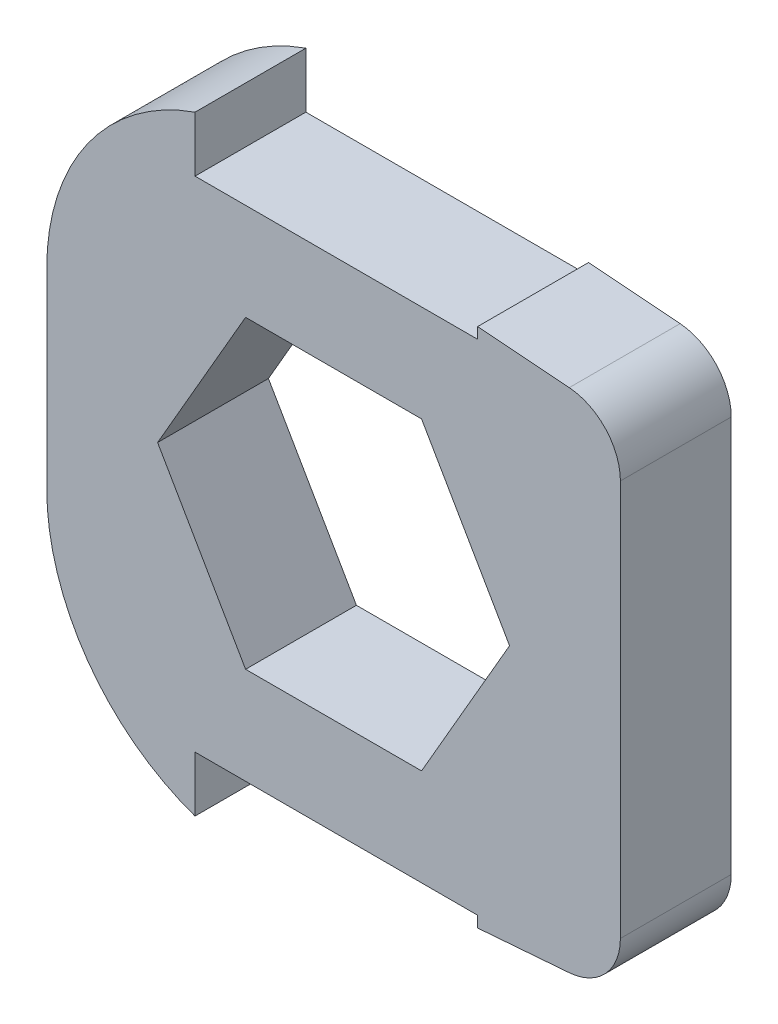
ISO-10303-21;
HEADER;
FILE_DESCRIPTION(('STEP AP214'),'2;1');
FILE_NAME('part.step','',(''),(''),'','','');
FILE_SCHEMA(('AUTOMOTIVE_DESIGN { 1 0 10303 214 1 1 1 1 }'));
ENDSEC;
DATA;
#1=APPLICATION_CONTEXT('core data for automotive mechanical design processes');
#2=APPLICATION_PROTOCOL_DEFINITION('international standard','automotive_design',2000,#1);
#3=PRODUCT_CONTEXT('',#1,'mechanical');
#4=PRODUCT('Part','Part','',(#3));
#5=PRODUCT_RELATED_PRODUCT_CATEGORY('part','',(#4));
#6=PRODUCT_DEFINITION_FORMATION('','',#4);
#7=PRODUCT_DEFINITION_CONTEXT('part definition',#1,'design');
#8=PRODUCT_DEFINITION('design','',#6,#7);
#9=PRODUCT_DEFINITION_SHAPE('','',#8);
#10=(LENGTH_UNIT() NAMED_UNIT(*) SI_UNIT(.MILLI.,.METRE.));
#11=(NAMED_UNIT(*) PLANE_ANGLE_UNIT() SI_UNIT($,.RADIAN.));
#12=(NAMED_UNIT(*) SI_UNIT($,.STERADIAN.) SOLID_ANGLE_UNIT());
#13=UNCERTAINTY_MEASURE_WITH_UNIT(LENGTH_MEASURE(1.E-05),#10,'distance_accuracy_value','');
#14=(GEOMETRIC_REPRESENTATION_CONTEXT(3) GLOBAL_UNCERTAINTY_ASSIGNED_CONTEXT((#13)) GLOBAL_UNIT_ASSIGNED_CONTEXT((#10,
#11,#12)) REPRESENTATION_CONTEXT('',''));
#15=CARTESIAN_POINT('',(0.,0.,0.));
#16=DIRECTION('',(0.,0.,1.));
#17=DIRECTION('',(1.,0.,0.));
#18=AXIS2_PLACEMENT_3D('',#15,#16,#17);
#19=CARTESIAN_POINT('',(0.,0.,2.));
#20=DIRECTION('',(0.,0.,-1.));
#21=DIRECTION('',(-1.,0.,0.));
#22=AXIS2_PLACEMENT_3D('',#19,#20,#21);
#23=PLANE('',#22);
#24=DIRECTION('',(0.996998261930065,0.0774239349841488,0.));
#25=VECTOR('',#24,1.);
#26=CARTESIAN_POINT('',(10.3508529610859,-4.5,2.));
#27=LINE('',#26,#25);
#28=CARTESIAN_POINT('',(7.77542648054295,-4.7,2.));
#29=VERTEX_POINT('',#28);
#30=CARTESIAN_POINT('',(9.42827689607004,-4.57164452738106,2.));
#31=VERTEX_POINT('',#30);
#32=EDGE_CURVE('E243',#29,#31,#27,.T.);
#33=ORIENTED_EDGE('',*,*,#32,.T.);
#34=CARTESIAN_POINT('',(9.35085296108589,-3.57464626545099,2.));
#35=DIRECTION('',(0.,0.,-1.));
#36=DIRECTION('',(-1.,0.,0.));
#37=AXIS2_PLACEMENT_3D('',#34,#35,#36);
#38=CIRCLE('',#37,1.);
#39=CARTESIAN_POINT('',(10.3508529610859,-3.57464626545099,2.));
#40=VERTEX_POINT('',#39);
#41=EDGE_CURVE('E44',#31,#40,#38,.F.);
#42=ORIENTED_EDGE('',*,*,#41,.T.);
#43=DIRECTION('',(0.,1.,0.));
#44=VECTOR('',#43,1.);
#45=CARTESIAN_POINT('',(10.3508529610859,4.5,2.));
#46=LINE('',#45,#44);
#47=CARTESIAN_POINT('',(10.3508529610859,3.574646265451,2.));
#48=VERTEX_POINT('',#47);
#49=EDGE_CURVE('E245',#40,#48,#46,.T.);
#50=ORIENTED_EDGE('',*,*,#49,.T.);
#51=CARTESIAN_POINT('',(9.35085296108589,3.574646265451,2.));
#52=DIRECTION('',(0.,0.,-1.));
#53=DIRECTION('',(-1.,0.,0.));
#54=AXIS2_PLACEMENT_3D('',#51,#52,#53);
#55=CIRCLE('',#54,1.);
#56=CARTESIAN_POINT('',(9.42827689607004,4.57164452738106,2.));
#57=VERTEX_POINT('',#56);
#58=EDGE_CURVE('E51',#48,#57,#55,.F.);
#59=ORIENTED_EDGE('',*,*,#58,.T.);
#60=DIRECTION('',(-0.996998261930065,0.0774239349841488,0.));
#61=VECTOR('',#60,1.);
#62=CARTESIAN_POINT('',(10.3508529610859,4.5,2.));
#63=LINE('',#62,#61);
#64=CARTESIAN_POINT('',(7.77542648054295,4.7,2.));
#65=VERTEX_POINT('',#64);
#66=EDGE_CURVE('E247',#57,#65,#63,.T.);
#67=ORIENTED_EDGE('',*,*,#66,.T.);
#68=DIRECTION('',(0.,-1.,0.));
#69=VECTOR('',#68,1.);
#70=CARTESIAN_POINT('',(7.77542648054295,4.7,2.));
#71=LINE('',#70,#69);
#72=CARTESIAN_POINT('',(7.77542648054295,4.5,2.));
#73=VERTEX_POINT('',#72);
#74=EDGE_CURVE('E249',#65,#73,#71,.T.);
#75=ORIENTED_EDGE('',*,*,#74,.T.);
#76=DIRECTION('',(-1.,0.,0.));
#77=VECTOR('',#76,1.);
#78=CARTESIAN_POINT('',(7.77542648054295,4.5,2.));
#79=LINE('',#78,#77);
#80=CARTESIAN_POINT('',(2.67542648054295,4.5,2.));
#81=VERTEX_POINT('',#80);
#82=EDGE_CURVE('E251',#73,#81,#79,.T.);
#83=ORIENTED_EDGE('',*,*,#82,.T.);
#84=DIRECTION('',(0.,1.,0.));
#85=VECTOR('',#84,1.);
#86=CARTESIAN_POINT('',(2.67542648054295,5.5,2.));
#87=LINE('',#86,#85);
#88=CARTESIAN_POINT('',(2.67542648054295,5.5,2.));
#89=VERTEX_POINT('',#88);
#90=EDGE_CURVE('E253',#81,#89,#87,.T.);
#91=ORIENTED_EDGE('',*,*,#90,.T.);
#92=CARTESIAN_POINT('',(4.,1.72567820773676,2.));
#93=DIRECTION('',(0.,0.,-1.));
#94=DIRECTION('',(-1.,0.,0.));
#95=AXIS2_PLACEMENT_3D('',#92,#93,#94);
#96=CIRCLE('',#95,4.);
#97=CARTESIAN_POINT('',(0.,1.72567820773676,2.));
#98=VERTEX_POINT('',#97);
#99=EDGE_CURVE('E309',#89,#98,#96,.F.);
#100=ORIENTED_EDGE('',*,*,#99,.T.);
#101=DIRECTION('',(0.,-1.,0.));
#102=VECTOR('',#101,1.);
#103=CARTESIAN_POINT('',(0.,-5.5,2.));
#104=LINE('',#103,#102);
#105=CARTESIAN_POINT('',(0.,-1.72567820773676,2.));
#106=VERTEX_POINT('',#105);
#107=EDGE_CURVE('E233',#98,#106,#104,.T.);
#108=ORIENTED_EDGE('',*,*,#107,.T.);
#109=CARTESIAN_POINT('',(4.,-1.72567820773676,2.));
#110=DIRECTION('',(0.,0.,-1.));
#111=DIRECTION('',(-1.,0.,0.));
#112=AXIS2_PLACEMENT_3D('',#109,#110,#111);
#113=CIRCLE('',#112,4.);
#114=CARTESIAN_POINT('',(2.67542648054295,-5.5,2.));
#115=VERTEX_POINT('',#114);
#116=EDGE_CURVE('E311',#106,#115,#113,.F.);
#117=ORIENTED_EDGE('',*,*,#116,.T.);
#118=DIRECTION('',(0.,1.,0.));
#119=VECTOR('',#118,1.);
#120=CARTESIAN_POINT('',(2.67542648054295,-4.5,2.));
#121=LINE('',#120,#119);
#122=CARTESIAN_POINT('',(2.67542648054295,-4.5,2.));
#123=VERTEX_POINT('',#122);
#124=EDGE_CURVE('E236',#115,#123,#121,.T.);
#125=ORIENTED_EDGE('',*,*,#124,.T.);
#126=DIRECTION('',(1.,0.,0.));
#127=VECTOR('',#126,1.);
#128=CARTESIAN_POINT('',(7.77542648054295,-4.5,2.));
#129=LINE('',#128,#127);
#130=CARTESIAN_POINT('',(7.77542648054295,-4.5,2.));
#131=VERTEX_POINT('',#130);
#132=EDGE_CURVE('E239',#123,#131,#129,.T.);
#133=ORIENTED_EDGE('',*,*,#132,.T.);
#134=DIRECTION('',(0.,-1.,0.));
#135=VECTOR('',#134,1.);
#136=CARTESIAN_POINT('',(7.77542648054295,-4.7,2.));
#137=LINE('',#136,#135);
#138=EDGE_CURVE('E241',#131,#29,#137,.T.);
#139=ORIENTED_EDGE('',*,*,#138,.T.);
#140=EDGE_LOOP('',(#33,#42,#50,#59,#67,#75,#83,#91,#100,#108,#117,#125,#133,#139));
#141=FACE_BOUND('',#140,.T.);
#142=DIRECTION('',(-0.5,-0.866025403784438,0.));
#143=VECTOR('',#142,1.);
#144=CARTESIAN_POINT('',(3.58771324027147,2.75,2.));
#145=LINE('',#144,#143);
#146=CARTESIAN_POINT('',(3.58771324027147,2.75,2.));
#147=VERTEX_POINT('',#146);
#148=CARTESIAN_POINT('',(2.,0.,2.));
#149=VERTEX_POINT('',#148);
#150=EDGE_CURVE('E177',#147,#149,#145,.T.);
#151=ORIENTED_EDGE('',*,*,#150,.F.);
#152=DIRECTION('',(-1.,0.,0.));
#153=VECTOR('',#152,1.);
#154=CARTESIAN_POINT('',(6.76313972081442,2.75,2.));
#155=LINE('',#154,#153);
#156=CARTESIAN_POINT('',(6.76313972081442,2.75,2.));
#157=VERTEX_POINT('',#156);
#158=EDGE_CURVE('E209',#157,#147,#155,.T.);
#159=ORIENTED_EDGE('',*,*,#158,.F.);
#160=DIRECTION('',(-0.5,0.866025403784438,0.));
#161=VECTOR('',#160,1.);
#162=CARTESIAN_POINT('',(8.35085296108589,0.,2.));
#163=LINE('',#162,#161);
#164=CARTESIAN_POINT('',(8.35085296108589,0.,2.));
#165=VERTEX_POINT('',#164);
#166=EDGE_CURVE('E206',#165,#157,#163,.T.);
#167=ORIENTED_EDGE('',*,*,#166,.F.);
#168=DIRECTION('',(0.5,0.866025403784439,0.));
#169=VECTOR('',#168,1.);
#170=CARTESIAN_POINT('',(6.76313972081442,-2.75,2.));
#171=LINE('',#170,#169);
#172=CARTESIAN_POINT('',(6.76313972081442,-2.75,2.));
#173=VERTEX_POINT('',#172);
#174=EDGE_CURVE('E202',#173,#165,#171,.T.);
#175=ORIENTED_EDGE('',*,*,#174,.F.);
#176=DIRECTION('',(1.,0.,0.));
#177=VECTOR('',#176,1.);
#178=CARTESIAN_POINT('',(3.58771324027147,-2.75,2.));
#179=LINE('',#178,#177);
#180=CARTESIAN_POINT('',(3.58771324027147,-2.75,2.));
#181=VERTEX_POINT('',#180);
#182=EDGE_CURVE('E200',#181,#173,#179,.T.);
#183=ORIENTED_EDGE('',*,*,#182,.F.);
#184=DIRECTION('',(0.500000000000002,-0.866025403784438,0.));
#185=VECTOR('',#184,1.);
#186=CARTESIAN_POINT('',(2.,0.,2.));
#187=LINE('',#186,#185);
#188=EDGE_CURVE('E187',#149,#181,#187,.T.);
#189=ORIENTED_EDGE('',*,*,#188,.F.);
#190=EDGE_LOOP('',(#151,#159,#167,#175,#183,#189));
#191=FACE_BOUND('',#190,.T.);
#192=ADVANCED_FACE('F36',(#141,#191),#23,.F.);
#193=CARTESIAN_POINT('',(0.,0.,0.));
#194=DIRECTION('',(0.,0.,-1.));
#195=DIRECTION('',(-1.,0.,0.));
#196=AXIS2_PLACEMENT_3D('',#193,#194,#195);
#197=PLANE('',#196);
#198=DIRECTION('',(0.,1.,0.));
#199=VECTOR('',#198,1.);
#200=CARTESIAN_POINT('',(10.3508529610859,4.5,0.));
#201=LINE('',#200,#199);
#202=CARTESIAN_POINT('',(10.3508529610859,-3.57464626545099,0.));
#203=VERTEX_POINT('',#202);
#204=CARTESIAN_POINT('',(10.3508529610859,3.574646265451,0.));
#205=VERTEX_POINT('',#204);
#206=EDGE_CURVE('E266',#203,#205,#201,.T.);
#207=ORIENTED_EDGE('',*,*,#206,.F.);
#208=CARTESIAN_POINT('',(9.35085296108589,-3.57464626545099,0.));
#209=DIRECTION('',(0.,0.,-1.));
#210=DIRECTION('',(-1.,0.,0.));
#211=AXIS2_PLACEMENT_3D('',#208,#209,#210);
#212=CIRCLE('',#211,1.);
#213=CARTESIAN_POINT('',(9.42827689607004,-4.57164452738106,0.));
#214=VERTEX_POINT('',#213);
#215=EDGE_CURVE('E320',#203,#214,#212,.T.);
#216=ORIENTED_EDGE('',*,*,#215,.T.);
#217=DIRECTION('',(0.996998261930065,0.0774239349841488,0.));
#218=VECTOR('',#217,1.);
#219=CARTESIAN_POINT('',(10.3508529610859,-4.5,0.));
#220=LINE('',#219,#218);
#221=CARTESIAN_POINT('',(7.77542648054295,-4.7,0.));
#222=VERTEX_POINT('',#221);
#223=EDGE_CURVE('E264',#222,#214,#220,.T.);
#224=ORIENTED_EDGE('',*,*,#223,.F.);
#225=DIRECTION('',(0.,-1.,0.));
#226=VECTOR('',#225,1.);
#227=CARTESIAN_POINT('',(7.77542648054295,-4.7,0.));
#228=LINE('',#227,#226);
#229=CARTESIAN_POINT('',(7.77542648054295,-4.5,0.));
#230=VERTEX_POINT('',#229);
#231=EDGE_CURVE('E262',#230,#222,#228,.T.);
#232=ORIENTED_EDGE('',*,*,#231,.F.);
#233=DIRECTION('',(1.,0.,0.));
#234=VECTOR('',#233,1.);
#235=CARTESIAN_POINT('',(7.77542648054295,-4.5,0.));
#236=LINE('',#235,#234);
#237=CARTESIAN_POINT('',(2.67542648054295,-4.5,0.));
#238=VERTEX_POINT('',#237);
#239=EDGE_CURVE('E260',#238,#230,#236,.T.);
#240=ORIENTED_EDGE('',*,*,#239,.F.);
#241=DIRECTION('',(0.,1.,0.));
#242=VECTOR('',#241,1.);
#243=CARTESIAN_POINT('',(2.67542648054295,-4.5,0.));
#244=LINE('',#243,#242);
#245=CARTESIAN_POINT('',(2.67542648054295,-5.5,0.));
#246=VERTEX_POINT('',#245);
#247=EDGE_CURVE('E258',#246,#238,#244,.T.);
#248=ORIENTED_EDGE('',*,*,#247,.F.);
#249=CARTESIAN_POINT('',(4.,-1.72567820773676,0.));
#250=DIRECTION('',(0.,0.,-1.));
#251=DIRECTION('',(-1.,0.,0.));
#252=AXIS2_PLACEMENT_3D('',#249,#250,#251);
#253=CIRCLE('',#252,4.);
#254=CARTESIAN_POINT('',(0.,-1.72567820773676,0.));
#255=VERTEX_POINT('',#254);
#256=EDGE_CURVE('E302',#246,#255,#253,.T.);
#257=ORIENTED_EDGE('',*,*,#256,.T.);
#258=DIRECTION('',(0.,-1.,0.));
#259=VECTOR('',#258,1.);
#260=CARTESIAN_POINT('',(0.,-5.5,0.));
#261=LINE('',#260,#259);
#262=CARTESIAN_POINT('',(0.,1.72567820773676,0.));
#263=VERTEX_POINT('',#262);
#264=EDGE_CURVE('E195',#263,#255,#261,.T.);
#265=ORIENTED_EDGE('',*,*,#264,.F.);
#266=CARTESIAN_POINT('',(4.,1.72567820773676,0.));
#267=DIRECTION('',(0.,0.,-1.));
#268=DIRECTION('',(-1.,0.,0.));
#269=AXIS2_PLACEMENT_3D('',#266,#267,#268);
#270=CIRCLE('',#269,4.);
#271=CARTESIAN_POINT('',(2.67542648054295,5.5,0.));
#272=VERTEX_POINT('',#271);
#273=EDGE_CURVE('E300',#263,#272,#270,.T.);
#274=ORIENTED_EDGE('',*,*,#273,.T.);
#275=DIRECTION('',(0.,1.,0.));
#276=VECTOR('',#275,1.);
#277=CARTESIAN_POINT('',(2.67542648054295,5.5,0.));
#278=LINE('',#277,#276);
#279=CARTESIAN_POINT('',(2.67542648054295,4.5,0.));
#280=VERTEX_POINT('',#279);
#281=EDGE_CURVE('E237',#280,#272,#278,.T.);
#282=ORIENTED_EDGE('',*,*,#281,.F.);
#283=DIRECTION('',(-1.,0.,0.));
#284=VECTOR('',#283,1.);
#285=CARTESIAN_POINT('',(7.77542648054295,4.5,0.));
#286=LINE('',#285,#284);
#287=CARTESIAN_POINT('',(7.77542648054295,4.5,0.));
#288=VERTEX_POINT('',#287);
#289=EDGE_CURVE('E273',#288,#280,#286,.T.);
#290=ORIENTED_EDGE('',*,*,#289,.F.);
#291=DIRECTION('',(0.,-1.,0.));
#292=VECTOR('',#291,1.);
#293=CARTESIAN_POINT('',(7.77542648054295,4.7,0.));
#294=LINE('',#293,#292);
#295=CARTESIAN_POINT('',(7.77542648054295,4.7,0.));
#296=VERTEX_POINT('',#295);
#297=EDGE_CURVE('E271',#296,#288,#294,.T.);
#298=ORIENTED_EDGE('',*,*,#297,.F.);
#299=DIRECTION('',(-0.996998261930065,0.0774239349841488,0.));
#300=VECTOR('',#299,1.);
#301=CARTESIAN_POINT('',(10.3508529610859,4.5,0.));
#302=LINE('',#301,#300);
#303=CARTESIAN_POINT('',(9.42827689607004,4.57164452738106,0.));
#304=VERTEX_POINT('',#303);
#305=EDGE_CURVE('E269',#304,#296,#302,.T.);
#306=ORIENTED_EDGE('',*,*,#305,.F.);
#307=CARTESIAN_POINT('',(9.35085296108589,3.574646265451,0.));
#308=DIRECTION('',(0.,0.,-1.));
#309=DIRECTION('',(-1.,0.,0.));
#310=AXIS2_PLACEMENT_3D('',#307,#308,#309);
#311=CIRCLE('',#310,1.);
#312=EDGE_CURVE('E318',#304,#205,#311,.T.);
#313=ORIENTED_EDGE('',*,*,#312,.T.);
#314=EDGE_LOOP('',(#207,#216,#224,#232,#240,#248,#257,#265,#274,#282,#290,#298,#306,#313));
#315=FACE_BOUND('',#314,.T.);
#316=DIRECTION('',(-1.,0.,0.));
#317=VECTOR('',#316,1.);
#318=CARTESIAN_POINT('',(6.76313972081442,2.75,0.));
#319=LINE('',#318,#317);
#320=CARTESIAN_POINT('',(6.76313972081442,2.75,0.));
#321=VERTEX_POINT('',#320);
#322=CARTESIAN_POINT('',(3.58771324027147,2.75,0.));
#323=VERTEX_POINT('',#322);
#324=EDGE_CURVE('E188',#321,#323,#319,.T.);
#325=ORIENTED_EDGE('',*,*,#324,.T.);
#326=DIRECTION('',(-0.5,-0.866025403784438,0.));
#327=VECTOR('',#326,1.);
#328=CARTESIAN_POINT('',(3.58771324027147,2.75,0.));
#329=LINE('',#328,#327);
#330=CARTESIAN_POINT('',(2.,0.,0.));
#331=VERTEX_POINT('',#330);
#332=EDGE_CURVE('E211',#323,#331,#329,.T.);
#333=ORIENTED_EDGE('',*,*,#332,.T.);
#334=DIRECTION('',(0.500000000000002,-0.866025403784438,0.));
#335=VECTOR('',#334,1.);
#336=CARTESIAN_POINT('',(2.,0.,0.));
#337=LINE('',#336,#335);
#338=CARTESIAN_POINT('',(3.58771324027147,-2.75,0.));
#339=VERTEX_POINT('',#338);
#340=EDGE_CURVE('E194',#331,#339,#337,.T.);
#341=ORIENTED_EDGE('',*,*,#340,.T.);
#342=DIRECTION('',(1.,0.,0.));
#343=VECTOR('',#342,1.);
#344=CARTESIAN_POINT('',(3.58771324027147,-2.75,0.));
#345=LINE('',#344,#343);
#346=CARTESIAN_POINT('',(6.76313972081442,-2.75,0.));
#347=VERTEX_POINT('',#346);
#348=EDGE_CURVE('E214',#339,#347,#345,.T.);
#349=ORIENTED_EDGE('',*,*,#348,.T.);
#350=DIRECTION('',(0.5,0.866025403784439,0.));
#351=VECTOR('',#350,1.);
#352=CARTESIAN_POINT('',(6.76313972081442,-2.75,0.));
#353=LINE('',#352,#351);
#354=CARTESIAN_POINT('',(8.35085296108589,0.,0.));
#355=VERTEX_POINT('',#354);
#356=EDGE_CURVE('E217',#347,#355,#353,.T.);
#357=ORIENTED_EDGE('',*,*,#356,.T.);
#358=DIRECTION('',(-0.5,0.866025403784438,0.));
#359=VECTOR('',#358,1.);
#360=CARTESIAN_POINT('',(8.35085296108589,0.,0.));
#361=LINE('',#360,#359);
#362=EDGE_CURVE('E220',#355,#321,#361,.T.);
#363=ORIENTED_EDGE('',*,*,#362,.T.);
#364=EDGE_LOOP('',(#325,#333,#341,#349,#357,#363));
#365=FACE_BOUND('',#364,.T.);
#366=ADVANCED_FACE('F334',(#315,#365),#197,.T.);
#367=CARTESIAN_POINT('',(0.,-5.5,2.));
#368=DIRECTION('',(1.,0.,0.));
#369=DIRECTION('',(0.,0.,-1.));
#370=AXIS2_PLACEMENT_3D('',#367,#368,#369);
#371=PLANE('',#370);
#372=ORIENTED_EDGE('',*,*,#264,.T.);
#373=DIRECTION('',(0.,0.,1.));
#374=VECTOR('',#373,1.);
#375=CARTESIAN_POINT('',(0.,-1.72567820773676,2.));
#376=LINE('',#375,#374);
#377=EDGE_CURVE('E307',#255,#106,#376,.T.);
#378=ORIENTED_EDGE('',*,*,#377,.T.);
#379=ORIENTED_EDGE('',*,*,#107,.F.);
#380=DIRECTION('',(0.,0.,-1.));
#381=VECTOR('',#380,1.);
#382=CARTESIAN_POINT('',(0.,1.72567820773676,2.));
#383=LINE('',#382,#381);
#384=EDGE_CURVE('E304',#98,#263,#383,.T.);
#385=ORIENTED_EDGE('',*,*,#384,.T.);
#386=EDGE_LOOP('',(#372,#378,#379,#385));
#387=FACE_BOUND('',#386,.T.);
#388=ADVANCED_FACE('F359',(#387),#371,.F.);
#389=CARTESIAN_POINT('',(2.67542648054295,-4.5,2.));
#390=DIRECTION('',(-1.,0.,0.));
#391=DIRECTION('',(0.,-1.,0.));
#392=AXIS2_PLACEMENT_3D('',#389,#390,#391);
#393=PLANE('',#392);
#394=ORIENTED_EDGE('',*,*,#247,.T.);
#395=DIRECTION('',(0.,0.,-1.));
#396=VECTOR('',#395,1.);
#397=CARTESIAN_POINT('',(2.67542648054295,-4.5,2.));
#398=LINE('',#397,#396);
#399=EDGE_CURVE('E294',#123,#238,#398,.T.);
#400=ORIENTED_EDGE('',*,*,#399,.F.);
#401=ORIENTED_EDGE('',*,*,#124,.F.);
#402=DIRECTION('',(0.,0.,-1.));
#403=VECTOR('',#402,1.);
#404=CARTESIAN_POINT('',(2.67542648054295,-5.5,2.));
#405=LINE('',#404,#403);
#406=EDGE_CURVE('E297',#115,#246,#405,.T.);
#407=ORIENTED_EDGE('',*,*,#406,.T.);
#408=EDGE_LOOP('',(#394,#400,#401,#407));
#409=FACE_BOUND('',#408,.T.);
#410=ADVANCED_FACE('F351',(#409),#393,.F.);
#411=CARTESIAN_POINT('',(7.77542648054295,-4.5,2.));
#412=DIRECTION('',(0.,1.,0.));
#413=DIRECTION('',(-1.,0.,0.));
#414=AXIS2_PLACEMENT_3D('',#411,#412,#413);
#415=PLANE('',#414);
#416=ORIENTED_EDGE('',*,*,#239,.T.);
#417=DIRECTION('',(0.,0.,-1.));
#418=VECTOR('',#417,1.);
#419=CARTESIAN_POINT('',(7.77542648054295,-4.5,2.));
#420=LINE('',#419,#418);
#421=EDGE_CURVE('E291',#131,#230,#420,.T.);
#422=ORIENTED_EDGE('',*,*,#421,.F.);
#423=ORIENTED_EDGE('',*,*,#132,.F.);
#424=ORIENTED_EDGE('',*,*,#399,.T.);
#425=EDGE_LOOP('',(#416,#422,#423,#424));
#426=FACE_BOUND('',#425,.T.);
#427=ADVANCED_FACE('F346',(#426),#415,.F.);
#428=CARTESIAN_POINT('',(7.77542648054295,-4.7,2.));
#429=DIRECTION('',(1.,0.,0.));
#430=DIRECTION('',(0.,0.,-1.));
#431=AXIS2_PLACEMENT_3D('',#428,#429,#430);
#432=PLANE('',#431);
#433=ORIENTED_EDGE('',*,*,#231,.T.);
#434=DIRECTION('',(0.,0.,-1.));
#435=VECTOR('',#434,1.);
#436=CARTESIAN_POINT('',(7.77542648054295,-4.7,2.));
#437=LINE('',#436,#435);
#438=EDGE_CURVE('E288',#29,#222,#437,.T.);
#439=ORIENTED_EDGE('',*,*,#438,.F.);
#440=ORIENTED_EDGE('',*,*,#138,.F.);
#441=ORIENTED_EDGE('',*,*,#421,.T.);
#442=EDGE_LOOP('',(#433,#439,#440,#441));
#443=FACE_BOUND('',#442,.T.);
#444=ADVANCED_FACE('F341',(#443),#432,.F.);
#445=CARTESIAN_POINT('',(10.3508529610859,-4.5,2.));
#446=DIRECTION('',(-0.0774239349841488,0.996998261930065,0.));
#447=DIRECTION('',(-0.996998261930065,-0.0774239349841488,0.));
#448=AXIS2_PLACEMENT_3D('',#445,#446,#447);
#449=PLANE('',#448);
#450=ORIENTED_EDGE('',*,*,#223,.T.);
#451=DIRECTION('',(0.,0.,-1.));
#452=VECTOR('',#451,1.);
#453=CARTESIAN_POINT('',(9.42827689607004,-4.57164452738106,2.));
#454=LINE('',#453,#452);
#455=EDGE_CURVE('E59',#214,#31,#454,.F.);
#456=ORIENTED_EDGE('',*,*,#455,.T.);
#457=ORIENTED_EDGE('',*,*,#32,.F.);
#458=ORIENTED_EDGE('',*,*,#438,.T.);
#459=EDGE_LOOP('',(#450,#456,#457,#458));
#460=FACE_BOUND('',#459,.T.);
#461=ADVANCED_FACE('F337',(#460),#449,.F.);
#462=CARTESIAN_POINT('',(10.3508529610859,4.5,2.));
#463=DIRECTION('',(-1.,0.,0.));
#464=DIRECTION('',(0.,0.,1.));
#465=AXIS2_PLACEMENT_3D('',#462,#463,#464);
#466=PLANE('',#465);
#467=ORIENTED_EDGE('',*,*,#49,.F.);
#468=DIRECTION('',(0.,0.,-1.));
#469=VECTOR('',#468,1.);
#470=CARTESIAN_POINT('',(10.3508529610859,-3.57464626545099,2.));
#471=LINE('',#470,#469);
#472=EDGE_CURVE('E315',#40,#203,#471,.T.);
#473=ORIENTED_EDGE('',*,*,#472,.T.);
#474=ORIENTED_EDGE('',*,*,#206,.T.);
#475=DIRECTION('',(0.,0.,-1.));
#476=VECTOR('',#475,1.);
#477=CARTESIAN_POINT('',(10.3508529610859,3.574646265451,2.));
#478=LINE('',#477,#476);
#479=EDGE_CURVE('E313',#205,#48,#478,.F.);
#480=ORIENTED_EDGE('',*,*,#479,.T.);
#481=EDGE_LOOP('',(#467,#473,#474,#480));
#482=FACE_BOUND('',#481,.T.);
#483=ADVANCED_FACE('F328',(#482),#466,.F.);
#484=CARTESIAN_POINT('',(10.3508529610859,4.5,2.));
#485=DIRECTION('',(-0.0774239349841488,-0.996998261930065,0.));
#486=DIRECTION('',(0.996998261930065,-0.0774239349841488,0.));
#487=AXIS2_PLACEMENT_3D('',#484,#485,#486);
#488=PLANE('',#487);
#489=ORIENTED_EDGE('',*,*,#66,.F.);
#490=DIRECTION('',(0.,0.,-1.));
#491=VECTOR('',#490,1.);
#492=CARTESIAN_POINT('',(9.42827689607004,4.57164452738106,2.));
#493=LINE('',#492,#491);
#494=EDGE_CURVE('E11',#57,#304,#493,.T.);
#495=ORIENTED_EDGE('',*,*,#494,.T.);
#496=ORIENTED_EDGE('',*,*,#305,.T.);
#497=DIRECTION('',(0.,0.,-1.));
#498=VECTOR('',#497,1.);
#499=CARTESIAN_POINT('',(7.77542648054295,4.7,2.));
#500=LINE('',#499,#498);
#501=EDGE_CURVE('E285',#65,#296,#500,.T.);
#502=ORIENTED_EDGE('',*,*,#501,.F.);
#503=EDGE_LOOP('',(#489,#495,#496,#502));
#504=FACE_BOUND('',#503,.T.);
#505=ADVANCED_FACE('F383',(#504),#488,.F.);
#506=CARTESIAN_POINT('',(7.77542648054295,4.7,2.));
#507=DIRECTION('',(1.,0.,0.));
#508=DIRECTION('',(0.,0.,-1.));
#509=AXIS2_PLACEMENT_3D('',#506,#507,#508);
#510=PLANE('',#509);
#511=ORIENTED_EDGE('',*,*,#297,.T.);
#512=DIRECTION('',(0.,0.,-1.));
#513=VECTOR('',#512,1.);
#514=CARTESIAN_POINT('',(7.77542648054295,4.5,2.));
#515=LINE('',#514,#513);
#516=EDGE_CURVE('E282',#73,#288,#515,.T.);
#517=ORIENTED_EDGE('',*,*,#516,.F.);
#518=ORIENTED_EDGE('',*,*,#74,.F.);
#519=ORIENTED_EDGE('',*,*,#501,.T.);
#520=EDGE_LOOP('',(#511,#517,#518,#519));
#521=FACE_BOUND('',#520,.T.);
#522=ADVANCED_FACE('F379',(#521),#510,.F.);
#523=CARTESIAN_POINT('',(7.77542648054295,4.5,2.));
#524=DIRECTION('',(0.,-1.,0.));
#525=DIRECTION('',(1.,0.,0.));
#526=AXIS2_PLACEMENT_3D('',#523,#524,#525);
#527=PLANE('',#526);
#528=ORIENTED_EDGE('',*,*,#289,.T.);
#529=DIRECTION('',(0.,0.,-1.));
#530=VECTOR('',#529,1.);
#531=CARTESIAN_POINT('',(2.67542648054295,4.5,2.));
#532=LINE('',#531,#530);
#533=EDGE_CURVE('E279',#81,#280,#532,.T.);
#534=ORIENTED_EDGE('',*,*,#533,.F.);
#535=ORIENTED_EDGE('',*,*,#82,.F.);
#536=ORIENTED_EDGE('',*,*,#516,.T.);
#537=EDGE_LOOP('',(#528,#534,#535,#536));
#538=FACE_BOUND('',#537,.T.);
#539=ADVANCED_FACE('F374',(#538),#527,.F.);
#540=CARTESIAN_POINT('',(2.67542648054295,5.5,2.));
#541=DIRECTION('',(-1.,0.,0.));
#542=DIRECTION('',(0.,-1.,0.));
#543=AXIS2_PLACEMENT_3D('',#540,#541,#542);
#544=PLANE('',#543);
#545=ORIENTED_EDGE('',*,*,#281,.T.);
#546=DIRECTION('',(0.,0.,-1.));
#547=VECTOR('',#546,1.);
#548=CARTESIAN_POINT('',(2.67542648054295,5.5,2.));
#549=LINE('',#548,#547);
#550=EDGE_CURVE('E255',#89,#272,#549,.T.);
#551=ORIENTED_EDGE('',*,*,#550,.F.);
#552=ORIENTED_EDGE('',*,*,#90,.F.);
#553=ORIENTED_EDGE('',*,*,#533,.T.);
#554=EDGE_LOOP('',(#545,#551,#552,#553));
#555=FACE_BOUND('',#554,.T.);
#556=ADVANCED_FACE('F369',(#555),#544,.F.);
#557=CARTESIAN_POINT('',(3.58771324027147,2.75,2.));
#558=DIRECTION('',(0.866025403784439,-0.5,0.));
#559=DIRECTION('',(0.5,0.866025403784438,0.));
#560=AXIS2_PLACEMENT_3D('',#557,#558,#559);
#561=PLANE('',#560);
#562=ORIENTED_EDGE('',*,*,#332,.F.);
#563=DIRECTION('',(0.,0.,-1.));
#564=VECTOR('',#563,1.);
#565=CARTESIAN_POINT('',(3.58771324027147,2.75,2.));
#566=LINE('',#565,#564);
#567=EDGE_CURVE('E183',#147,#323,#566,.T.);
#568=ORIENTED_EDGE('',*,*,#567,.F.);
#569=ORIENTED_EDGE('',*,*,#150,.T.);
#570=DIRECTION('',(0.,0.,-1.));
#571=VECTOR('',#570,1.);
#572=CARTESIAN_POINT('',(2.,0.,2.));
#573=LINE('',#572,#571);
#574=EDGE_CURVE('E180',#149,#331,#573,.T.);
#575=ORIENTED_EDGE('',*,*,#574,.T.);
#576=EDGE_LOOP('',(#562,#568,#569,#575));
#577=FACE_BOUND('',#576,.T.);
#578=ADVANCED_FACE('F179',(#577),#561,.T.);
#579=CARTESIAN_POINT('',(2.,0.,2.));
#580=DIRECTION('',(0.866025403784438,0.500000000000002,0.));
#581=DIRECTION('',(-0.500000000000002,0.866025403784438,0.));
#582=AXIS2_PLACEMENT_3D('',#579,#580,#581);
#583=PLANE('',#582);
#584=ORIENTED_EDGE('',*,*,#340,.F.);
#585=ORIENTED_EDGE('',*,*,#574,.F.);
#586=ORIENTED_EDGE('',*,*,#188,.T.);
#587=DIRECTION('',(0.,0.,-1.));
#588=VECTOR('',#587,1.);
#589=CARTESIAN_POINT('',(3.58771324027147,-2.75,2.));
#590=LINE('',#589,#588);
#591=EDGE_CURVE('E196',#181,#339,#590,.T.);
#592=ORIENTED_EDGE('',*,*,#591,.T.);
#593=EDGE_LOOP('',(#584,#585,#586,#592));
#594=FACE_BOUND('',#593,.T.);
#595=ADVANCED_FACE('F191',(#594),#583,.T.);
#596=CARTESIAN_POINT('',(3.58771324027147,-2.75,2.));
#597=DIRECTION('',(0.,1.,0.));
#598=DIRECTION('',(0.,0.,1.));
#599=AXIS2_PLACEMENT_3D('',#596,#597,#598);
#600=PLANE('',#599);
#601=ORIENTED_EDGE('',*,*,#348,.F.);
#602=ORIENTED_EDGE('',*,*,#591,.F.);
#603=ORIENTED_EDGE('',*,*,#182,.T.);
#604=DIRECTION('',(0.,0.,-1.));
#605=VECTOR('',#604,1.);
#606=CARTESIAN_POINT('',(6.76313972081442,-2.75,2.));
#607=LINE('',#606,#605);
#608=EDGE_CURVE('E230',#173,#347,#607,.T.);
#609=ORIENTED_EDGE('',*,*,#608,.T.);
#610=EDGE_LOOP('',(#601,#602,#603,#609));
#611=FACE_BOUND('',#610,.T.);
#612=ADVANCED_FACE('F513',(#611),#600,.T.);
#613=CARTESIAN_POINT('',(6.76313972081442,-2.75,2.));
#614=DIRECTION('',(-0.866025403784439,0.5,0.));
#615=DIRECTION('',(-0.5,-0.866025403784439,0.));
#616=AXIS2_PLACEMENT_3D('',#613,#614,#615);
#617=PLANE('',#616);
#618=ORIENTED_EDGE('',*,*,#356,.F.);
#619=ORIENTED_EDGE('',*,*,#608,.F.);
#620=ORIENTED_EDGE('',*,*,#174,.T.);
#621=DIRECTION('',(0.,0.,-1.));
#622=VECTOR('',#621,1.);
#623=CARTESIAN_POINT('',(8.35085296108589,0.,2.));
#624=LINE('',#623,#622);
#625=EDGE_CURVE('E228',#165,#355,#624,.T.);
#626=ORIENTED_EDGE('',*,*,#625,.T.);
#627=EDGE_LOOP('',(#618,#619,#620,#626));
#628=FACE_BOUND('',#627,.T.);
#629=ADVANCED_FACE('F521',(#628),#617,.T.);
#630=CARTESIAN_POINT('',(8.35085296108589,0.,2.));
#631=DIRECTION('',(-0.866025403784439,-0.5,0.));
#632=DIRECTION('',(0.5,-0.866025403784438,0.));
#633=AXIS2_PLACEMENT_3D('',#630,#631,#632);
#634=PLANE('',#633);
#635=ORIENTED_EDGE('',*,*,#362,.F.);
#636=ORIENTED_EDGE('',*,*,#625,.F.);
#637=ORIENTED_EDGE('',*,*,#166,.T.);
#638=DIRECTION('',(0.,0.,-1.));
#639=VECTOR('',#638,1.);
#640=CARTESIAN_POINT('',(6.76313972081442,2.75,2.));
#641=LINE('',#640,#639);
#642=EDGE_CURVE('E226',#157,#321,#641,.T.);
#643=ORIENTED_EDGE('',*,*,#642,.T.);
#644=EDGE_LOOP('',(#635,#636,#637,#643));
#645=FACE_BOUND('',#644,.T.);
#646=ADVANCED_FACE('F531',(#645),#634,.T.);
#647=CARTESIAN_POINT('',(6.76313972081442,2.75,2.));
#648=DIRECTION('',(0.,-1.,0.));
#649=DIRECTION('',(1.,0.,0.));
#650=AXIS2_PLACEMENT_3D('',#647,#648,#649);
#651=PLANE('',#650);
#652=ORIENTED_EDGE('',*,*,#324,.F.);
#653=ORIENTED_EDGE('',*,*,#642,.F.);
#654=ORIENTED_EDGE('',*,*,#158,.T.);
#655=ORIENTED_EDGE('',*,*,#567,.T.);
#656=EDGE_LOOP('',(#652,#653,#654,#655));
#657=FACE_BOUND('',#656,.T.);
#658=ADVANCED_FACE('F421',(#657),#651,.T.);
#659=CARTESIAN_POINT('',(4.,-1.72567820773676,2.));
#660=DIRECTION('',(0.,0.,1.));
#661=DIRECTION('',(1.,0.,0.));
#662=AXIS2_PLACEMENT_3D('',#659,#660,#661);
#663=CYLINDRICAL_SURFACE('',#662,4.);
#664=ORIENTED_EDGE('',*,*,#116,.F.);
#665=ORIENTED_EDGE('',*,*,#377,.F.);
#666=ORIENTED_EDGE('',*,*,#256,.F.);
#667=ORIENTED_EDGE('',*,*,#406,.F.);
#668=EDGE_LOOP('',(#664,#665,#666,#667));
#669=FACE_BOUND('',#668,.T.);
#670=ADVANCED_FACE('F355',(#669),#663,.T.);
#671=CARTESIAN_POINT('',(4.,1.72567820773676,2.));
#672=DIRECTION('',(0.,0.,-1.));
#673=DIRECTION('',(-1.,0.,0.));
#674=AXIS2_PLACEMENT_3D('',#671,#672,#673);
#675=CYLINDRICAL_SURFACE('',#674,4.);
#676=ORIENTED_EDGE('',*,*,#99,.F.);
#677=ORIENTED_EDGE('',*,*,#550,.T.);
#678=ORIENTED_EDGE('',*,*,#273,.F.);
#679=ORIENTED_EDGE('',*,*,#384,.F.);
#680=EDGE_LOOP('',(#676,#677,#678,#679));
#681=FACE_BOUND('',#680,.T.);
#682=ADVANCED_FACE('F364',(#681),#675,.T.);
#683=CARTESIAN_POINT('',(9.35085296108589,-3.57464626545099,2.));
#684=DIRECTION('',(0.,0.,-1.));
#685=DIRECTION('',(-1.,0.,0.));
#686=AXIS2_PLACEMENT_3D('',#683,#684,#685);
#687=CYLINDRICAL_SURFACE('',#686,1.);
#688=ORIENTED_EDGE('',*,*,#41,.F.);
#689=ORIENTED_EDGE('',*,*,#455,.F.);
#690=ORIENTED_EDGE('',*,*,#215,.F.);
#691=ORIENTED_EDGE('',*,*,#472,.F.);
#692=EDGE_LOOP('',(#688,#689,#690,#691));
#693=FACE_BOUND('',#692,.T.);
#694=ADVANCED_FACE('F331',(#693),#687,.T.);
#695=CARTESIAN_POINT('',(9.35085296108589,3.574646265451,2.));
#696=DIRECTION('',(0.,0.,-1.));
#697=DIRECTION('',(-1.,0.,0.));
#698=AXIS2_PLACEMENT_3D('',#695,#696,#697);
#699=CYLINDRICAL_SURFACE('',#698,1.);
#700=ORIENTED_EDGE('',*,*,#58,.F.);
#701=ORIENTED_EDGE('',*,*,#479,.F.);
#702=ORIENTED_EDGE('',*,*,#312,.F.);
#703=ORIENTED_EDGE('',*,*,#494,.F.);
#704=EDGE_LOOP('',(#700,#701,#702,#703));
#705=FACE_BOUND('',#704,.T.);
#706=ADVANCED_FACE('F38',(#705),#699,.T.);
#707=CLOSED_SHELL('',(#192,#366,#388,#410,#427,#444,#461,#483,#505,#522,#539,#556,#578,#595,
#612,#629,#646,#658,#670,#682,#694,#706));
#708=MANIFOLD_SOLID_BREP('B2',#707);
#709=ADVANCED_BREP_SHAPE_REPRESENTATION('',(#18,#708),#14);
#710=SHAPE_DEFINITION_REPRESENTATION(#9,#709);
ENDSEC;
END-ISO-10303-21;
